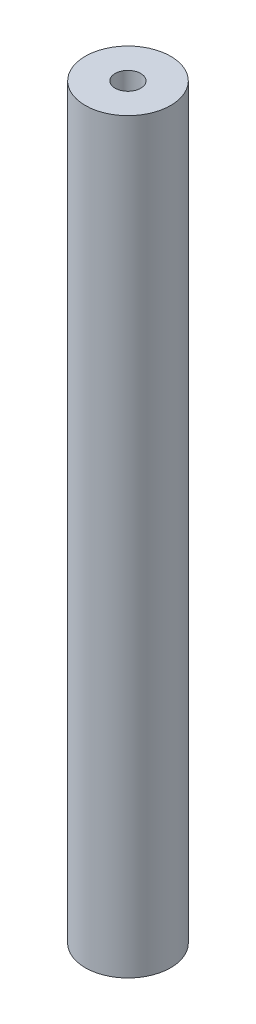
ISO-10303-21;
HEADER;
FILE_DESCRIPTION(('STEP AP214'),'2;1');
FILE_NAME('part.step','',(''),(''),'','','');
FILE_SCHEMA(('AUTOMOTIVE_DESIGN { 1 0 10303 214 1 1 1 1 }'));
ENDSEC;
DATA;
#1=APPLICATION_CONTEXT('core data for automotive mechanical design processes');
#2=APPLICATION_PROTOCOL_DEFINITION('international standard','automotive_design',2000,#1);
#3=PRODUCT_CONTEXT('',#1,'mechanical');
#4=PRODUCT('Part','Part','',(#3));
#5=PRODUCT_RELATED_PRODUCT_CATEGORY('part','',(#4));
#6=PRODUCT_DEFINITION_FORMATION('','',#4);
#7=PRODUCT_DEFINITION_CONTEXT('part definition',#1,'design');
#8=PRODUCT_DEFINITION('design','',#6,#7);
#9=PRODUCT_DEFINITION_SHAPE('','',#8);
#10=(LENGTH_UNIT() NAMED_UNIT(*) SI_UNIT(.MILLI.,.METRE.));
#11=(NAMED_UNIT(*) PLANE_ANGLE_UNIT() SI_UNIT($,.RADIAN.));
#12=(NAMED_UNIT(*) SI_UNIT($,.STERADIAN.) SOLID_ANGLE_UNIT());
#13=UNCERTAINTY_MEASURE_WITH_UNIT(LENGTH_MEASURE(1.E-05),#10,'distance_accuracy_value','');
#14=(GEOMETRIC_REPRESENTATION_CONTEXT(3) GLOBAL_UNCERTAINTY_ASSIGNED_CONTEXT((#13)) GLOBAL_UNIT_ASSIGNED_CONTEXT((#10,
#11,#12)) REPRESENTATION_CONTEXT('',''));
#15=CARTESIAN_POINT('',(0.,0.,0.));
#16=DIRECTION('',(0.,0.,1.));
#17=DIRECTION('',(1.,0.,0.));
#18=AXIS2_PLACEMENT_3D('',#15,#16,#17);
#19=CARTESIAN_POINT('',(0.,88.9,0.));
#20=DIRECTION('',(0.,-1.,0.));
#21=DIRECTION('',(0.,0.,-1.));
#22=AXIS2_PLACEMENT_3D('',#19,#20,#21);
#23=CYLINDRICAL_SURFACE('',#22,5.08);
#24=CARTESIAN_POINT('',(0.,88.9,0.));
#25=DIRECTION('',(0.,1.,0.));
#26=DIRECTION('',(0.,0.,1.));
#27=AXIS2_PLACEMENT_3D('',#24,#25,#26);
#28=CIRCLE('',#27,5.08);
#29=CARTESIAN_POINT('',(0.,88.9,5.08));
#30=VERTEX_POINT('',#29);
#31=EDGE_CURVE('E11',#30,#30,#28,.T.);
#32=ORIENTED_EDGE('',*,*,#31,.F.);
#33=EDGE_LOOP('',(#32));
#34=FACE_BOUND('',#33,.T.);
#35=CARTESIAN_POINT('',(0.,0.,0.));
#36=DIRECTION('',(0.,1.,0.));
#37=DIRECTION('',(0.,0.,1.));
#38=AXIS2_PLACEMENT_3D('',#35,#36,#37);
#39=CIRCLE('',#38,5.08);
#40=CARTESIAN_POINT('',(0.,0.,5.08));
#41=VERTEX_POINT('',#40);
#42=EDGE_CURVE('E42',#41,#41,#39,.T.);
#43=ORIENTED_EDGE('',*,*,#42,.T.);
#44=EDGE_LOOP('',(#43));
#45=FACE_BOUND('',#44,.T.);
#46=ADVANCED_FACE('F39',(#34,#45),#23,.T.);
#47=CARTESIAN_POINT('',(0.,88.9,0.));
#48=DIRECTION('',(0.,1.,0.));
#49=DIRECTION('',(0.,0.,1.));
#50=AXIS2_PLACEMENT_3D('',#47,#48,#49);
#51=PLANE('',#50);
#52=CARTESIAN_POINT('',(0.,88.9,0.));
#53=DIRECTION('',(0.,1.,0.));
#54=DIRECTION('',(0.,0.,1.));
#55=AXIS2_PLACEMENT_3D('',#52,#53,#54);
#56=CIRCLE('',#55,1.52399999999999);
#57=CARTESIAN_POINT('',(0.,88.9,1.52399999999999));
#58=VERTEX_POINT('',#57);
#59=EDGE_CURVE('E62',#58,#58,#56,.T.);
#60=ORIENTED_EDGE('',*,*,#59,.F.);
#61=EDGE_LOOP('',(#60));
#62=FACE_BOUND('',#61,.T.);
#63=ORIENTED_EDGE('',*,*,#31,.T.);
#64=EDGE_LOOP('',(#63));
#65=FACE_BOUND('',#64,.T.);
#66=ADVANCED_FACE('F81',(#62,#65),#51,.T.);
#67=CARTESIAN_POINT('',(0.,0.,0.));
#68=DIRECTION('',(0.,1.,0.));
#69=DIRECTION('',(0.,0.,1.));
#70=AXIS2_PLACEMENT_3D('',#67,#68,#69);
#71=PLANE('',#70);
#72=CARTESIAN_POINT('',(0.,0.,0.));
#73=DIRECTION('',(0.,-1.,0.));
#74=DIRECTION('',(0.,0.,-1.));
#75=AXIS2_PLACEMENT_3D('',#72,#73,#74);
#76=CIRCLE('',#75,1.52399999999999);
#77=CARTESIAN_POINT('',(0.,0.,-1.52399999999999));
#78=VERTEX_POINT('',#77);
#79=EDGE_CURVE('E63',#78,#78,#76,.T.);
#80=ORIENTED_EDGE('',*,*,#79,.F.);
#81=EDGE_LOOP('',(#80));
#82=FACE_BOUND('',#81,.T.);
#83=ORIENTED_EDGE('',*,*,#42,.F.);
#84=EDGE_LOOP('',(#83));
#85=FACE_BOUND('',#84,.T.);
#86=ADVANCED_FACE('F78',(#82,#85),#71,.F.);
#87=CARTESIAN_POINT('',(0.,80.772,0.));
#88=DIRECTION('',(0.,1.,0.));
#89=DIRECTION('',(0.,0.,1.));
#90=AXIS2_PLACEMENT_3D('',#87,#88,#89);
#91=CONICAL_SURFACE('',#90,1.524,1.02974425867665);
#92=CARTESIAN_POINT('',(0.,79.856288416602,0.));
#93=VERTEX_POINT('',#92);
#94=VERTEX_LOOP('',#93);
#95=FACE_BOUND('',#94,.T.);
#96=CARTESIAN_POINT('',(0.,80.772,0.));
#97=DIRECTION('',(0.,1.,0.));
#98=DIRECTION('',(0.,0.,1.));
#99=AXIS2_PLACEMENT_3D('',#96,#97,#98);
#100=CIRCLE('',#99,1.524);
#101=CARTESIAN_POINT('',(0.,80.772,1.524));
#102=VERTEX_POINT('',#101);
#103=EDGE_CURVE('E66',#102,#102,#100,.T.);
#104=ORIENTED_EDGE('',*,*,#103,.T.);
#105=EDGE_LOOP('',(#104));
#106=FACE_BOUND('',#105,.T.);
#107=ADVANCED_FACE('F80',(#95,#106),#91,.F.);
#108=CARTESIAN_POINT('',(0.,88.9,0.));
#109=DIRECTION('',(0.,1.,0.));
#110=DIRECTION('',(0.,0.,1.));
#111=AXIS2_PLACEMENT_3D('',#108,#109,#110);
#112=CYLINDRICAL_SURFACE('',#111,1.52399999999999);
#113=ORIENTED_EDGE('',*,*,#103,.F.);
#114=EDGE_LOOP('',(#113));
#115=FACE_BOUND('',#114,.T.);
#116=ORIENTED_EDGE('',*,*,#59,.T.);
#117=EDGE_LOOP('',(#116));
#118=FACE_BOUND('',#117,.T.);
#119=ADVANCED_FACE('F56',(#115,#118),#112,.F.);
#120=CARTESIAN_POINT('',(0.,8.128,0.));
#121=DIRECTION('',(0.,-1.,0.));
#122=DIRECTION('',(0.,0.,-1.));
#123=AXIS2_PLACEMENT_3D('',#120,#121,#122);
#124=CONICAL_SURFACE('',#123,1.524,1.02974425867665);
#125=CARTESIAN_POINT('',(0.,9.043711583398,0.));
#126=VERTEX_POINT('',#125);
#127=VERTEX_LOOP('',#126);
#128=FACE_BOUND('',#127,.T.);
#129=CARTESIAN_POINT('',(0.,8.128,0.));
#130=DIRECTION('',(0.,-1.,0.));
#131=DIRECTION('',(0.,0.,-1.));
#132=AXIS2_PLACEMENT_3D('',#129,#130,#131);
#133=CIRCLE('',#132,1.524);
#134=CARTESIAN_POINT('',(0.,8.128,-1.524));
#135=VERTEX_POINT('',#134);
#136=EDGE_CURVE('E60',#135,#135,#133,.T.);
#137=ORIENTED_EDGE('',*,*,#136,.T.);
#138=EDGE_LOOP('',(#137));
#139=FACE_BOUND('',#138,.T.);
#140=ADVANCED_FACE('F52',(#128,#139),#124,.F.);
#141=CARTESIAN_POINT('',(0.,0.,0.));
#142=DIRECTION('',(0.,-1.,0.));
#143=DIRECTION('',(0.,0.,-1.));
#144=AXIS2_PLACEMENT_3D('',#141,#142,#143);
#145=CYLINDRICAL_SURFACE('',#144,1.52399999999999);
#146=ORIENTED_EDGE('',*,*,#136,.F.);
#147=EDGE_LOOP('',(#146));
#148=FACE_BOUND('',#147,.T.);
#149=ORIENTED_EDGE('',*,*,#79,.T.);
#150=EDGE_LOOP('',(#149));
#151=FACE_BOUND('',#150,.T.);
#152=ADVANCED_FACE('F55',(#148,#151),#145,.F.);
#153=CLOSED_SHELL('',(#46,#66,#86,#107,#119,#140,#152));
#154=MANIFOLD_SOLID_BREP('B2',#153);
#155=ADVANCED_BREP_SHAPE_REPRESENTATION('',(#18,#154),#14);
#156=SHAPE_DEFINITION_REPRESENTATION(#9,#155);
ENDSEC;
END-ISO-10303-21;
